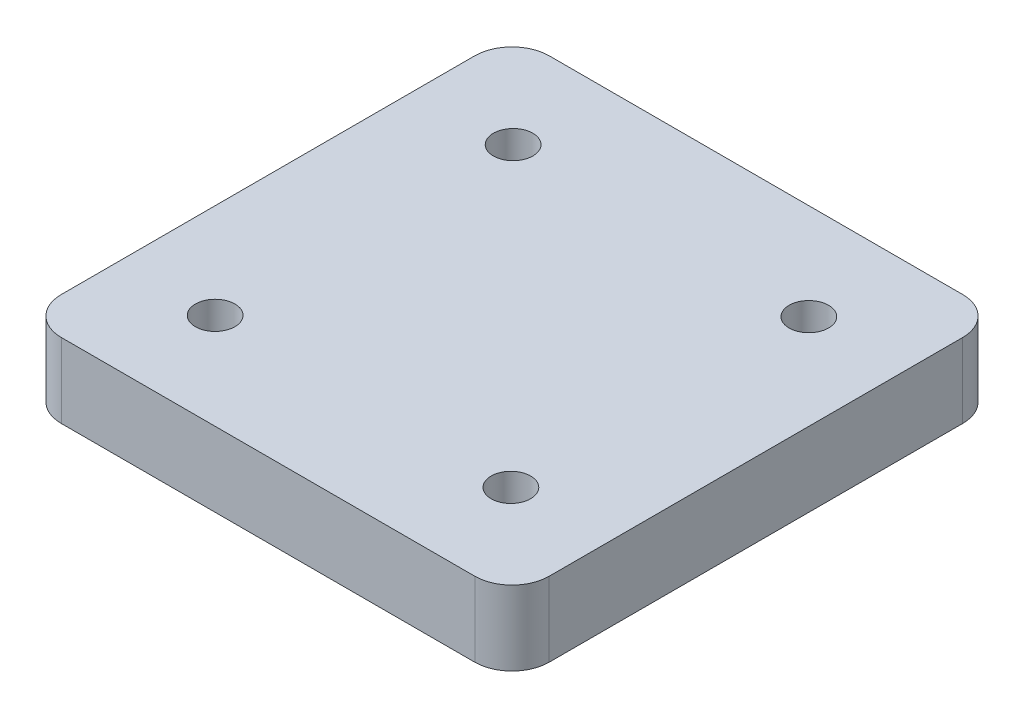
ISO-10303-21;
HEADER;
FILE_DESCRIPTION(('STEP AP214'),'2;1');
FILE_NAME('part.step','',(''),(''),'','','');
FILE_SCHEMA(('AUTOMOTIVE_DESIGN { 1 0 10303 214 1 1 1 1 }'));
ENDSEC;
DATA;
#1=APPLICATION_CONTEXT('core data for automotive mechanical design processes');
#2=APPLICATION_PROTOCOL_DEFINITION('international standard','automotive_design',2000,#1);
#3=PRODUCT_CONTEXT('',#1,'mechanical');
#4=PRODUCT('Part','Part','',(#3));
#5=PRODUCT_RELATED_PRODUCT_CATEGORY('part','',(#4));
#6=PRODUCT_DEFINITION_FORMATION('','',#4);
#7=PRODUCT_DEFINITION_CONTEXT('part definition',#1,'design');
#8=PRODUCT_DEFINITION('design','',#6,#7);
#9=PRODUCT_DEFINITION_SHAPE('','',#8);
#10=(LENGTH_UNIT() NAMED_UNIT(*) SI_UNIT(.MILLI.,.METRE.));
#11=(NAMED_UNIT(*) PLANE_ANGLE_UNIT() SI_UNIT($,.RADIAN.));
#12=(NAMED_UNIT(*) SI_UNIT($,.STERADIAN.) SOLID_ANGLE_UNIT());
#13=UNCERTAINTY_MEASURE_WITH_UNIT(LENGTH_MEASURE(1.E-05),#10,'distance_accuracy_value','');
#14=(GEOMETRIC_REPRESENTATION_CONTEXT(3) GLOBAL_UNCERTAINTY_ASSIGNED_CONTEXT((#13)) GLOBAL_UNIT_ASSIGNED_CONTEXT((#10,
#11,#12)) REPRESENTATION_CONTEXT('',''));
#15=CARTESIAN_POINT('',(0.,0.,0.));
#16=DIRECTION('',(0.,0.,1.));
#17=DIRECTION('',(1.,0.,0.));
#18=AXIS2_PLACEMENT_3D('',#15,#16,#17);
#19=CARTESIAN_POINT('',(27.75,10.,-27.75));
#20=DIRECTION('',(0.,-1.,0.));
#21=DIRECTION('',(0.,0.,-1.));
#22=AXIS2_PLACEMENT_3D('',#19,#20,#21);
#23=PLANE('',#22);
#24=CARTESIAN_POINT('',(27.75,10.,-27.75));
#25=DIRECTION('',(0.,1.,0.));
#26=DIRECTION('',(0.,0.,-1.));
#27=AXIS2_PLACEMENT_3D('',#24,#25,#26);
#28=CIRCLE('',#27,5.);
#29=CARTESIAN_POINT('',(32.75,10.,-27.75));
#30=VERTEX_POINT('',#29);
#31=CARTESIAN_POINT('',(27.75,10.,-32.75));
#32=VERTEX_POINT('',#31);
#33=EDGE_CURVE('E149',#30,#32,#28,.T.);
#34=ORIENTED_EDGE('',*,*,#33,.T.);
#35=DIRECTION('',(-1.,0.,0.));
#36=VECTOR('',#35,1.);
#37=CARTESIAN_POINT('',(-27.75,10.,-32.75));
#38=LINE('',#37,#36);
#39=CARTESIAN_POINT('',(-27.75,10.,-32.75));
#40=VERTEX_POINT('',#39);
#41=EDGE_CURVE('E97',#32,#40,#38,.T.);
#42=ORIENTED_EDGE('',*,*,#41,.T.);
#43=CARTESIAN_POINT('',(-27.75,10.,-27.75));
#44=DIRECTION('',(0.,1.,0.));
#45=DIRECTION('',(0.,0.,-1.));
#46=AXIS2_PLACEMENT_3D('',#43,#44,#45);
#47=CIRCLE('',#46,5.);
#48=CARTESIAN_POINT('',(-32.75,10.,-27.75));
#49=VERTEX_POINT('',#48);
#50=EDGE_CURVE('E164',#40,#49,#47,.T.);
#51=ORIENTED_EDGE('',*,*,#50,.T.);
#52=DIRECTION('',(0.,0.,1.));
#53=VECTOR('',#52,1.);
#54=CARTESIAN_POINT('',(-32.75,10.,27.75));
#55=LINE('',#54,#53);
#56=CARTESIAN_POINT('',(-32.75,10.,27.75));
#57=VERTEX_POINT('',#56);
#58=EDGE_CURVE('E177',#49,#57,#55,.T.);
#59=ORIENTED_EDGE('',*,*,#58,.T.);
#60=CARTESIAN_POINT('',(-27.75,10.,27.75));
#61=DIRECTION('',(0.,1.,0.));
#62=DIRECTION('',(0.,0.,-1.));
#63=AXIS2_PLACEMENT_3D('',#60,#61,#62);
#64=CIRCLE('',#63,5.);
#65=CARTESIAN_POINT('',(-27.75,10.,32.75));
#66=VERTEX_POINT('',#65);
#67=EDGE_CURVE('E116',#57,#66,#64,.T.);
#68=ORIENTED_EDGE('',*,*,#67,.T.);
#69=DIRECTION('',(1.,0.,0.));
#70=VECTOR('',#69,1.);
#71=CARTESIAN_POINT('',(-27.75,10.,32.75));
#72=LINE('',#71,#70);
#73=CARTESIAN_POINT('',(27.75,10.,32.75));
#74=VERTEX_POINT('',#73);
#75=EDGE_CURVE('E110',#66,#74,#72,.T.);
#76=ORIENTED_EDGE('',*,*,#75,.T.);
#77=CARTESIAN_POINT('',(27.75,10.,27.75));
#78=DIRECTION('',(0.,1.,0.));
#79=DIRECTION('',(0.,0.,1.));
#80=AXIS2_PLACEMENT_3D('',#77,#78,#79);
#81=CIRCLE('',#80,5.);
#82=CARTESIAN_POINT('',(32.75,10.,27.75));
#83=VERTEX_POINT('',#82);
#84=EDGE_CURVE('E114',#74,#83,#81,.T.);
#85=ORIENTED_EDGE('',*,*,#84,.T.);
#86=DIRECTION('',(0.,0.,-1.));
#87=VECTOR('',#86,1.);
#88=CARTESIAN_POINT('',(32.75,10.,27.75));
#89=LINE('',#88,#87);
#90=EDGE_CURVE('E54',#83,#30,#89,.T.);
#91=ORIENTED_EDGE('',*,*,#90,.T.);
#92=EDGE_LOOP('',(#34,#42,#51,#59,#68,#76,#85,#91));
#93=FACE_BOUND('',#92,.T.);
#94=CARTESIAN_POINT('',(-19.85,10.,-20.));
#95=DIRECTION('',(0.,1.,0.));
#96=DIRECTION('',(0.,0.,1.));
#97=AXIS2_PLACEMENT_3D('',#94,#95,#96);
#98=CIRCLE('',#97,2.65);
#99=CARTESIAN_POINT('',(-19.85,10.,-17.35));
#100=VERTEX_POINT('',#99);
#101=EDGE_CURVE('E138',#100,#100,#98,.T.);
#102=ORIENTED_EDGE('',*,*,#101,.F.);
#103=EDGE_LOOP('',(#102));
#104=FACE_BOUND('',#103,.T.);
#105=CARTESIAN_POINT('',(20.0000000000001,10.,-19.85));
#106=DIRECTION('',(0.,1.,0.));
#107=DIRECTION('',(0.,0.,1.));
#108=AXIS2_PLACEMENT_3D('',#105,#106,#107);
#109=CIRCLE('',#108,2.65);
#110=CARTESIAN_POINT('',(20.0000000000001,10.,-17.2));
#111=VERTEX_POINT('',#110);
#112=EDGE_CURVE('E186',#111,#111,#109,.T.);
#113=ORIENTED_EDGE('',*,*,#112,.F.);
#114=EDGE_LOOP('',(#113));
#115=FACE_BOUND('',#114,.T.);
#116=CARTESIAN_POINT('',(19.8499999999999,10.,20.0000000000001));
#117=DIRECTION('',(0.,1.,0.));
#118=DIRECTION('',(0.,0.,1.));
#119=AXIS2_PLACEMENT_3D('',#116,#117,#118);
#120=CIRCLE('',#119,2.65);
#121=CARTESIAN_POINT('',(19.8499999999999,10.,22.6500000000001));
#122=VERTEX_POINT('',#121);
#123=EDGE_CURVE('E192',#122,#122,#120,.T.);
#124=ORIENTED_EDGE('',*,*,#123,.F.);
#125=EDGE_LOOP('',(#124));
#126=FACE_BOUND('',#125,.T.);
#127=CARTESIAN_POINT('',(-20.0000000000002,10.,19.8499999999998));
#128=DIRECTION('',(0.,1.,0.));
#129=DIRECTION('',(0.,0.,1.));
#130=AXIS2_PLACEMENT_3D('',#127,#128,#129);
#131=CIRCLE('',#130,2.65);
#132=CARTESIAN_POINT('',(-20.0000000000002,10.,22.4999999999998));
#133=VERTEX_POINT('',#132);
#134=EDGE_CURVE('E198',#133,#133,#131,.T.);
#135=ORIENTED_EDGE('',*,*,#134,.F.);
#136=EDGE_LOOP('',(#135));
#137=FACE_BOUND('',#136,.T.);
#138=ADVANCED_FACE('F37',(#93,#104,#115,#126,#137),#23,.F.);
#139=CARTESIAN_POINT('',(27.75,0.,-27.75));
#140=DIRECTION('',(0.,-1.,0.));
#141=DIRECTION('',(0.,0.,-1.));
#142=AXIS2_PLACEMENT_3D('',#139,#140,#141);
#143=PLANE('',#142);
#144=CARTESIAN_POINT('',(19.8499999999999,0.,20.0000000000001));
#145=DIRECTION('',(0.,1.,0.));
#146=DIRECTION('',(0.,0.,1.));
#147=AXIS2_PLACEMENT_3D('',#144,#145,#146);
#148=CIRCLE('',#147,2.65);
#149=CARTESIAN_POINT('',(19.8499999999999,0.,22.6500000000001));
#150=VERTEX_POINT('',#149);
#151=EDGE_CURVE('E195',#150,#150,#148,.T.);
#152=ORIENTED_EDGE('',*,*,#151,.T.);
#153=EDGE_LOOP('',(#152));
#154=FACE_BOUND('',#153,.T.);
#155=CARTESIAN_POINT('',(-19.85,0.,-20.));
#156=DIRECTION('',(0.,1.,0.));
#157=DIRECTION('',(0.,0.,1.));
#158=AXIS2_PLACEMENT_3D('',#155,#156,#157);
#159=CIRCLE('',#158,2.65);
#160=CARTESIAN_POINT('',(-19.85,0.,-17.35));
#161=VERTEX_POINT('',#160);
#162=EDGE_CURVE('E183',#161,#161,#159,.T.);
#163=ORIENTED_EDGE('',*,*,#162,.T.);
#164=EDGE_LOOP('',(#163));
#165=FACE_BOUND('',#164,.T.);
#166=CARTESIAN_POINT('',(27.75,0.,-27.75));
#167=DIRECTION('',(0.,1.,0.));
#168=DIRECTION('',(0.,0.,-1.));
#169=AXIS2_PLACEMENT_3D('',#166,#167,#168);
#170=CIRCLE('',#169,5.);
#171=CARTESIAN_POINT('',(32.75,0.,-27.75));
#172=VERTEX_POINT('',#171);
#173=CARTESIAN_POINT('',(27.75,0.,-32.75));
#174=VERTEX_POINT('',#173);
#175=EDGE_CURVE('E134',#172,#174,#170,.T.);
#176=ORIENTED_EDGE('',*,*,#175,.F.);
#177=DIRECTION('',(0.,0.,-1.));
#178=VECTOR('',#177,1.);
#179=CARTESIAN_POINT('',(32.75,0.,27.75));
#180=LINE('',#179,#178);
#181=CARTESIAN_POINT('',(32.75,0.,27.75));
#182=VERTEX_POINT('',#181);
#183=EDGE_CURVE('E89',#182,#172,#180,.T.);
#184=ORIENTED_EDGE('',*,*,#183,.F.);
#185=CARTESIAN_POINT('',(27.75,0.,27.75));
#186=DIRECTION('',(0.,1.,0.));
#187=DIRECTION('',(0.,0.,1.));
#188=AXIS2_PLACEMENT_3D('',#185,#186,#187);
#189=CIRCLE('',#188,5.);
#190=CARTESIAN_POINT('',(27.75,0.,32.75));
#191=VERTEX_POINT('',#190);
#192=EDGE_CURVE('E83',#191,#182,#189,.T.);
#193=ORIENTED_EDGE('',*,*,#192,.F.);
#194=DIRECTION('',(1.,0.,0.));
#195=VECTOR('',#194,1.);
#196=CARTESIAN_POINT('',(-27.75,0.,32.75));
#197=LINE('',#196,#195);
#198=CARTESIAN_POINT('',(-27.75,0.,32.75));
#199=VERTEX_POINT('',#198);
#200=EDGE_CURVE('E124',#199,#191,#197,.T.);
#201=ORIENTED_EDGE('',*,*,#200,.F.);
#202=CARTESIAN_POINT('',(-27.75,0.,27.75));
#203=DIRECTION('',(0.,1.,0.));
#204=DIRECTION('',(0.,0.,-1.));
#205=AXIS2_PLACEMENT_3D('',#202,#203,#204);
#206=CIRCLE('',#205,5.);
#207=CARTESIAN_POINT('',(-32.75,0.,27.75));
#208=VERTEX_POINT('',#207);
#209=EDGE_CURVE('E144',#208,#199,#206,.T.);
#210=ORIENTED_EDGE('',*,*,#209,.F.);
#211=DIRECTION('',(0.,0.,1.));
#212=VECTOR('',#211,1.);
#213=CARTESIAN_POINT('',(-32.75,0.,27.75));
#214=LINE('',#213,#212);
#215=CARTESIAN_POINT('',(-32.75,0.,-27.75));
#216=VERTEX_POINT('',#215);
#217=EDGE_CURVE('E142',#216,#208,#214,.T.);
#218=ORIENTED_EDGE('',*,*,#217,.F.);
#219=CARTESIAN_POINT('',(-27.75,0.,-27.75));
#220=DIRECTION('',(0.,1.,0.));
#221=DIRECTION('',(0.,0.,-1.));
#222=AXIS2_PLACEMENT_3D('',#219,#220,#221);
#223=CIRCLE('',#222,5.);
#224=CARTESIAN_POINT('',(-27.75,0.,-32.75));
#225=VERTEX_POINT('',#224);
#226=EDGE_CURVE('E140',#225,#216,#223,.T.);
#227=ORIENTED_EDGE('',*,*,#226,.F.);
#228=DIRECTION('',(-1.,0.,0.));
#229=VECTOR('',#228,1.);
#230=CARTESIAN_POINT('',(-27.75,0.,-32.75));
#231=LINE('',#230,#229);
#232=EDGE_CURVE('E137',#174,#225,#231,.T.);
#233=ORIENTED_EDGE('',*,*,#232,.F.);
#234=EDGE_LOOP('',(#176,#184,#193,#201,#210,#218,#227,#233));
#235=FACE_BOUND('',#234,.T.);
#236=CARTESIAN_POINT('',(20.0000000000001,0.,-19.85));
#237=DIRECTION('',(0.,1.,0.));
#238=DIRECTION('',(0.,0.,1.));
#239=AXIS2_PLACEMENT_3D('',#236,#237,#238);
#240=CIRCLE('',#239,2.65);
#241=CARTESIAN_POINT('',(20.0000000000001,0.,-17.2));
#242=VERTEX_POINT('',#241);
#243=EDGE_CURVE('E189',#242,#242,#240,.T.);
#244=ORIENTED_EDGE('',*,*,#243,.T.);
#245=EDGE_LOOP('',(#244));
#246=FACE_BOUND('',#245,.T.);
#247=CARTESIAN_POINT('',(-20.0000000000002,0.,19.8499999999998));
#248=DIRECTION('',(0.,1.,0.));
#249=DIRECTION('',(0.,0.,1.));
#250=AXIS2_PLACEMENT_3D('',#247,#248,#249);
#251=CIRCLE('',#250,2.65);
#252=CARTESIAN_POINT('',(-20.0000000000002,0.,22.4999999999998));
#253=VERTEX_POINT('',#252);
#254=EDGE_CURVE('E201',#253,#253,#251,.T.);
#255=ORIENTED_EDGE('',*,*,#254,.T.);
#256=EDGE_LOOP('',(#255));
#257=FACE_BOUND('',#256,.T.);
#258=ADVANCED_FACE('F168',(#154,#165,#235,#246,#257),#143,.T.);
#259=CARTESIAN_POINT('',(27.75,10.,-27.75));
#260=DIRECTION('',(0.,-1.,0.));
#261=DIRECTION('',(0.,0.,-1.));
#262=AXIS2_PLACEMENT_3D('',#259,#260,#261);
#263=CYLINDRICAL_SURFACE('',#262,5.);
#264=ORIENTED_EDGE('',*,*,#175,.T.);
#265=DIRECTION('',(0.,-1.,0.));
#266=VECTOR('',#265,1.);
#267=CARTESIAN_POINT('',(27.75,10.,-32.75));
#268=LINE('',#267,#266);
#269=EDGE_CURVE('E11',#32,#174,#268,.T.);
#270=ORIENTED_EDGE('',*,*,#269,.F.);
#271=ORIENTED_EDGE('',*,*,#33,.F.);
#272=DIRECTION('',(0.,-1.,0.));
#273=VECTOR('',#272,1.);
#274=CARTESIAN_POINT('',(32.75,10.,-27.75));
#275=LINE('',#274,#273);
#276=EDGE_CURVE('E130',#30,#172,#275,.T.);
#277=ORIENTED_EDGE('',*,*,#276,.T.);
#278=EDGE_LOOP('',(#264,#270,#271,#277));
#279=FACE_BOUND('',#278,.T.);
#280=ADVANCED_FACE('F39',(#279),#263,.T.);
#281=CARTESIAN_POINT('',(-27.75,10.,-32.75));
#282=DIRECTION('',(0.,0.,1.));
#283=DIRECTION('',(1.,0.,0.));
#284=AXIS2_PLACEMENT_3D('',#281,#282,#283);
#285=PLANE('',#284);
#286=ORIENTED_EDGE('',*,*,#232,.T.);
#287=DIRECTION('',(0.,-1.,0.));
#288=VECTOR('',#287,1.);
#289=CARTESIAN_POINT('',(-27.75,10.,-32.75));
#290=LINE('',#289,#288);
#291=EDGE_CURVE('E46',#40,#225,#290,.T.);
#292=ORIENTED_EDGE('',*,*,#291,.F.);
#293=ORIENTED_EDGE('',*,*,#41,.F.);
#294=ORIENTED_EDGE('',*,*,#269,.T.);
#295=EDGE_LOOP('',(#286,#292,#293,#294));
#296=FACE_BOUND('',#295,.T.);
#297=ADVANCED_FACE('F233',(#296),#285,.F.);
#298=CARTESIAN_POINT('',(-27.75,10.,-27.75));
#299=DIRECTION('',(0.,-1.,0.));
#300=DIRECTION('',(0.,0.,-1.));
#301=AXIS2_PLACEMENT_3D('',#298,#299,#300);
#302=CYLINDRICAL_SURFACE('',#301,5.);
#303=ORIENTED_EDGE('',*,*,#226,.T.);
#304=DIRECTION('',(0.,-1.,0.));
#305=VECTOR('',#304,1.);
#306=CARTESIAN_POINT('',(-32.75,10.,-27.75));
#307=LINE('',#306,#305);
#308=EDGE_CURVE('E156',#49,#216,#307,.T.);
#309=ORIENTED_EDGE('',*,*,#308,.F.);
#310=ORIENTED_EDGE('',*,*,#50,.F.);
#311=ORIENTED_EDGE('',*,*,#291,.T.);
#312=EDGE_LOOP('',(#303,#309,#310,#311));
#313=FACE_BOUND('',#312,.T.);
#314=ADVANCED_FACE('F162',(#313),#302,.T.);
#315=CARTESIAN_POINT('',(-32.75,10.,27.75));
#316=DIRECTION('',(1.,0.,0.));
#317=DIRECTION('',(0.,0.,-1.));
#318=AXIS2_PLACEMENT_3D('',#315,#316,#317);
#319=PLANE('',#318);
#320=ORIENTED_EDGE('',*,*,#217,.T.);
#321=DIRECTION('',(0.,-1.,0.));
#322=VECTOR('',#321,1.);
#323=CARTESIAN_POINT('',(-32.75,10.,27.75));
#324=LINE('',#323,#322);
#325=EDGE_CURVE('E153',#57,#208,#324,.T.);
#326=ORIENTED_EDGE('',*,*,#325,.F.);
#327=ORIENTED_EDGE('',*,*,#58,.F.);
#328=ORIENTED_EDGE('',*,*,#308,.T.);
#329=EDGE_LOOP('',(#320,#326,#327,#328));
#330=FACE_BOUND('',#329,.T.);
#331=ADVANCED_FACE('F173',(#330),#319,.F.);
#332=CARTESIAN_POINT('',(-27.75,10.,27.75));
#333=DIRECTION('',(0.,-1.,0.));
#334=DIRECTION('',(0.,0.,-1.));
#335=AXIS2_PLACEMENT_3D('',#332,#333,#334);
#336=CYLINDRICAL_SURFACE('',#335,5.);
#337=ORIENTED_EDGE('',*,*,#209,.T.);
#338=DIRECTION('',(0.,-1.,0.));
#339=VECTOR('',#338,1.);
#340=CARTESIAN_POINT('',(-27.75,10.,32.75));
#341=LINE('',#340,#339);
#342=EDGE_CURVE('E125',#66,#199,#341,.T.);
#343=ORIENTED_EDGE('',*,*,#342,.F.);
#344=ORIENTED_EDGE('',*,*,#67,.F.);
#345=ORIENTED_EDGE('',*,*,#325,.T.);
#346=EDGE_LOOP('',(#337,#343,#344,#345));
#347=FACE_BOUND('',#346,.T.);
#348=ADVANCED_FACE('F176',(#347),#336,.T.);
#349=CARTESIAN_POINT('',(-27.75,10.,32.75));
#350=DIRECTION('',(0.,0.,-1.));
#351=DIRECTION('',(-1.,0.,0.));
#352=AXIS2_PLACEMENT_3D('',#349,#350,#351);
#353=PLANE('',#352);
#354=ORIENTED_EDGE('',*,*,#200,.T.);
#355=DIRECTION('',(0.,-1.,0.));
#356=VECTOR('',#355,1.);
#357=CARTESIAN_POINT('',(27.75,10.,32.75));
#358=LINE('',#357,#356);
#359=EDGE_CURVE('E121',#74,#191,#358,.T.);
#360=ORIENTED_EDGE('',*,*,#359,.F.);
#361=ORIENTED_EDGE('',*,*,#75,.F.);
#362=ORIENTED_EDGE('',*,*,#342,.T.);
#363=EDGE_LOOP('',(#354,#360,#361,#362));
#364=FACE_BOUND('',#363,.T.);
#365=ADVANCED_FACE('F122',(#364),#353,.F.);
#366=CARTESIAN_POINT('',(27.75,10.,27.75));
#367=DIRECTION('',(0.,-1.,0.));
#368=DIRECTION('',(0.,0.,-1.));
#369=AXIS2_PLACEMENT_3D('',#366,#367,#368);
#370=CYLINDRICAL_SURFACE('',#369,5.);
#371=ORIENTED_EDGE('',*,*,#192,.T.);
#372=DIRECTION('',(0.,-1.,0.));
#373=VECTOR('',#372,1.);
#374=CARTESIAN_POINT('',(32.75,10.,27.75));
#375=LINE('',#374,#373);
#376=EDGE_CURVE('E126',#83,#182,#375,.T.);
#377=ORIENTED_EDGE('',*,*,#376,.F.);
#378=ORIENTED_EDGE('',*,*,#84,.F.);
#379=ORIENTED_EDGE('',*,*,#359,.T.);
#380=EDGE_LOOP('',(#371,#377,#378,#379));
#381=FACE_BOUND('',#380,.T.);
#382=ADVANCED_FACE('F128',(#381),#370,.T.);
#383=CARTESIAN_POINT('',(32.75,10.,27.75));
#384=DIRECTION('',(-1.,0.,0.));
#385=DIRECTION('',(0.,0.,1.));
#386=AXIS2_PLACEMENT_3D('',#383,#384,#385);
#387=PLANE('',#386);
#388=ORIENTED_EDGE('',*,*,#183,.T.);
#389=ORIENTED_EDGE('',*,*,#276,.F.);
#390=ORIENTED_EDGE('',*,*,#90,.F.);
#391=ORIENTED_EDGE('',*,*,#376,.T.);
#392=EDGE_LOOP('',(#388,#389,#390,#391));
#393=FACE_BOUND('',#392,.T.);
#394=ADVANCED_FACE('F221',(#393),#387,.F.);
#395=CARTESIAN_POINT('',(-19.85,10.,-20.));
#396=DIRECTION('',(0.,-1.,0.));
#397=DIRECTION('',(0.,0.,-1.));
#398=AXIS2_PLACEMENT_3D('',#395,#396,#397);
#399=CYLINDRICAL_SURFACE('',#398,2.65);
#400=ORIENTED_EDGE('',*,*,#101,.T.);
#401=EDGE_LOOP('',(#400));
#402=FACE_BOUND('',#401,.T.);
#403=ORIENTED_EDGE('',*,*,#162,.F.);
#404=EDGE_LOOP('',(#403));
#405=FACE_BOUND('',#404,.T.);
#406=ADVANCED_FACE('F218',(#402,#405),#399,.F.);
#407=CARTESIAN_POINT('',(20.0000000000001,10.,-19.85));
#408=DIRECTION('',(0.,-1.,0.));
#409=DIRECTION('',(0.,0.,-1.));
#410=AXIS2_PLACEMENT_3D('',#407,#408,#409);
#411=CYLINDRICAL_SURFACE('',#410,2.65);
#412=ORIENTED_EDGE('',*,*,#112,.T.);
#413=EDGE_LOOP('',(#412));
#414=FACE_BOUND('',#413,.T.);
#415=ORIENTED_EDGE('',*,*,#243,.F.);
#416=EDGE_LOOP('',(#415));
#417=FACE_BOUND('',#416,.T.);
#418=ADVANCED_FACE('F309',(#414,#417),#411,.F.);
#419=CARTESIAN_POINT('',(19.8499999999999,10.,20.0000000000001));
#420=DIRECTION('',(0.,-1.,0.));
#421=DIRECTION('',(0.,0.,-1.));
#422=AXIS2_PLACEMENT_3D('',#419,#420,#421);
#423=CYLINDRICAL_SURFACE('',#422,2.65);
#424=ORIENTED_EDGE('',*,*,#123,.T.);
#425=EDGE_LOOP('',(#424));
#426=FACE_BOUND('',#425,.T.);
#427=ORIENTED_EDGE('',*,*,#151,.F.);
#428=EDGE_LOOP('',(#427));
#429=FACE_BOUND('',#428,.T.);
#430=ADVANCED_FACE('F318',(#426,#429),#423,.F.);
#431=CARTESIAN_POINT('',(-20.0000000000002,10.,19.8499999999998));
#432=DIRECTION('',(0.,-1.,0.));
#433=DIRECTION('',(0.,0.,-1.));
#434=AXIS2_PLACEMENT_3D('',#431,#432,#433);
#435=CYLINDRICAL_SURFACE('',#434,2.65);
#436=ORIENTED_EDGE('',*,*,#134,.T.);
#437=EDGE_LOOP('',(#436));
#438=FACE_BOUND('',#437,.T.);
#439=ORIENTED_EDGE('',*,*,#254,.F.);
#440=EDGE_LOOP('',(#439));
#441=FACE_BOUND('',#440,.T.);
#442=ADVANCED_FACE('F207',(#438,#441),#435,.F.);
#443=CLOSED_SHELL('',(#138,#258,#280,#297,#314,#331,#348,#365,#382,#394,#406,#418,#430,#442));
#444=MANIFOLD_SOLID_BREP('B2',#443);
#445=ADVANCED_BREP_SHAPE_REPRESENTATION('',(#18,#444),#14);
#446=SHAPE_DEFINITION_REPRESENTATION(#9,#445);
ENDSEC;
END-ISO-10303-21;
